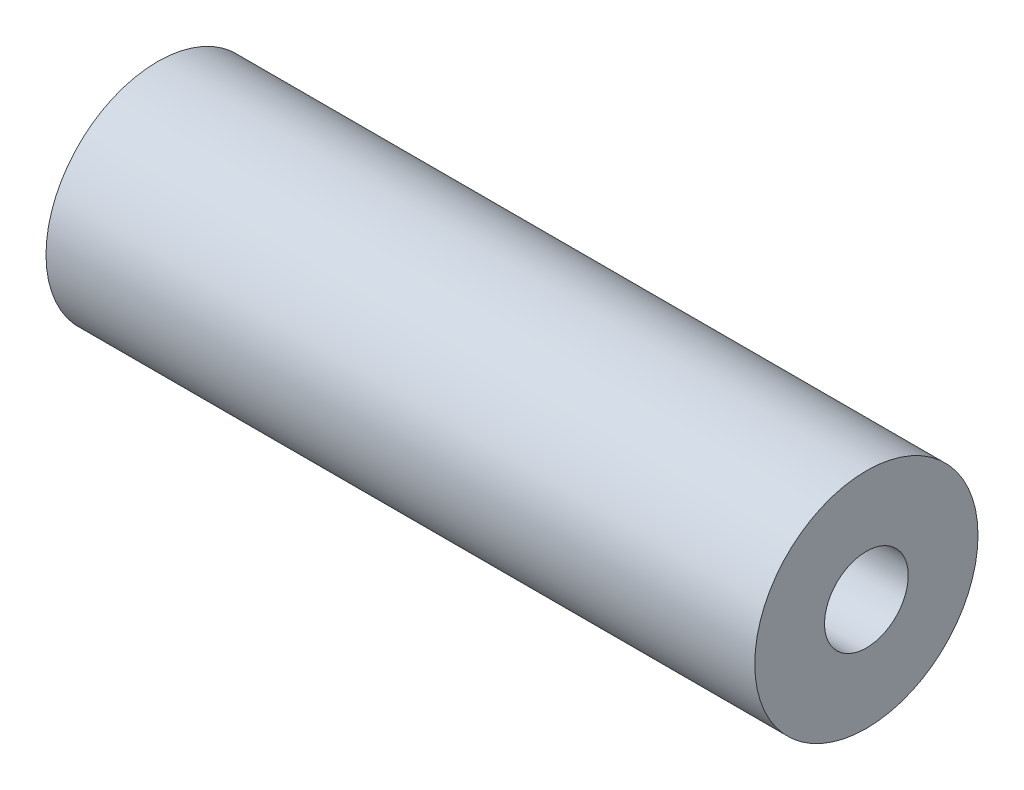
ISO-10303-21;
HEADER;
FILE_DESCRIPTION(('STEP AP214'),'2;1');
FILE_NAME('part.step','',(''),(''),'','','');
FILE_SCHEMA(('AUTOMOTIVE_DESIGN { 1 0 10303 214 1 1 1 1 }'));
ENDSEC;
DATA;
#1=APPLICATION_CONTEXT('core data for automotive mechanical design processes');
#2=APPLICATION_PROTOCOL_DEFINITION('international standard','automotive_design',2000,#1);
#3=PRODUCT_CONTEXT('',#1,'mechanical');
#4=PRODUCT('Part','Part','',(#3));
#5=PRODUCT_RELATED_PRODUCT_CATEGORY('part','',(#4));
#6=PRODUCT_DEFINITION_FORMATION('','',#4);
#7=PRODUCT_DEFINITION_CONTEXT('part definition',#1,'design');
#8=PRODUCT_DEFINITION('design','',#6,#7);
#9=PRODUCT_DEFINITION_SHAPE('','',#8);
#10=(LENGTH_UNIT() NAMED_UNIT(*) SI_UNIT(.MILLI.,.METRE.));
#11=(NAMED_UNIT(*) PLANE_ANGLE_UNIT() SI_UNIT($,.RADIAN.));
#12=(NAMED_UNIT(*) SI_UNIT($,.STERADIAN.) SOLID_ANGLE_UNIT());
#13=UNCERTAINTY_MEASURE_WITH_UNIT(LENGTH_MEASURE(1.E-05),#10,'distance_accuracy_value','');
#14=(GEOMETRIC_REPRESENTATION_CONTEXT(3) GLOBAL_UNCERTAINTY_ASSIGNED_CONTEXT((#13)) GLOBAL_UNIT_ASSIGNED_CONTEXT((#10,
#11,#12)) REPRESENTATION_CONTEXT('',''));
#15=CARTESIAN_POINT('',(0.,0.,0.));
#16=DIRECTION('',(0.,0.,1.));
#17=DIRECTION('',(1.,0.,0.));
#18=AXIS2_PLACEMENT_3D('',#15,#16,#17);
#19=CARTESIAN_POINT('',(25.4,0.,0.));
#20=DIRECTION('',(1.,0.,0.));
#21=DIRECTION('',(0.,0.,-1.));
#22=AXIS2_PLACEMENT_3D('',#19,#20,#21);
#23=PLANE('',#22);
#24=CARTESIAN_POINT('',(25.4,0.,0.));
#25=DIRECTION('',(1.,0.,0.));
#26=DIRECTION('',(0.,0.,-1.));
#27=AXIS2_PLACEMENT_3D('',#24,#25,#26);
#28=CIRCLE('',#27,4.);
#29=CARTESIAN_POINT('',(25.4,0.,-4.));
#30=VERTEX_POINT('',#29);
#31=EDGE_CURVE('E10',#30,#30,#28,.T.);
#32=ORIENTED_EDGE('',*,*,#31,.T.);
#33=EDGE_LOOP('',(#32));
#34=FACE_BOUND('',#33,.T.);
#35=CARTESIAN_POINT('',(25.4,0.,0.));
#36=DIRECTION('',(1.,0.,0.));
#37=DIRECTION('',(0.,0.,-1.));
#38=AXIS2_PLACEMENT_3D('',#35,#36,#37);
#39=CIRCLE('',#38,1.5);
#40=CARTESIAN_POINT('',(25.4,0.,-1.5));
#41=VERTEX_POINT('',#40);
#42=EDGE_CURVE('E42',#41,#41,#39,.T.);
#43=ORIENTED_EDGE('',*,*,#42,.F.);
#44=EDGE_LOOP('',(#43));
#45=FACE_BOUND('',#44,.T.);
#46=ADVANCED_FACE('F31',(#34,#45),#23,.T.);
#47=CARTESIAN_POINT('',(0.,0.,0.));
#48=DIRECTION('',(1.,0.,0.));
#49=DIRECTION('',(0.,0.,-1.));
#50=AXIS2_PLACEMENT_3D('',#47,#48,#49);
#51=PLANE('',#50);
#52=CARTESIAN_POINT('',(0.,0.,0.));
#53=DIRECTION('',(1.,0.,0.));
#54=DIRECTION('',(0.,0.,-1.));
#55=AXIS2_PLACEMENT_3D('',#52,#53,#54);
#56=CIRCLE('',#55,4.);
#57=CARTESIAN_POINT('',(0.,0.,-4.));
#58=VERTEX_POINT('',#57);
#59=EDGE_CURVE('E35',#58,#58,#56,.T.);
#60=ORIENTED_EDGE('',*,*,#59,.F.);
#61=EDGE_LOOP('',(#60));
#62=FACE_BOUND('',#61,.T.);
#63=CARTESIAN_POINT('',(0.,0.,0.));
#64=DIRECTION('',(1.,0.,0.));
#65=DIRECTION('',(0.,0.,-1.));
#66=AXIS2_PLACEMENT_3D('',#63,#64,#65);
#67=CIRCLE('',#66,1.5);
#68=CARTESIAN_POINT('',(0.,0.,-1.5));
#69=VERTEX_POINT('',#68);
#70=EDGE_CURVE('E44',#69,#69,#67,.T.);
#71=ORIENTED_EDGE('',*,*,#70,.T.);
#72=EDGE_LOOP('',(#71));
#73=FACE_BOUND('',#72,.T.);
#74=ADVANCED_FACE('F54',(#62,#73),#51,.F.);
#75=CARTESIAN_POINT('',(25.4,0.,0.));
#76=DIRECTION('',(-1.,0.,0.));
#77=DIRECTION('',(0.,0.,1.));
#78=AXIS2_PLACEMENT_3D('',#75,#76,#77);
#79=CYLINDRICAL_SURFACE('',#78,4.);
#80=ORIENTED_EDGE('',*,*,#31,.F.);
#81=EDGE_LOOP('',(#80));
#82=FACE_BOUND('',#81,.T.);
#83=ORIENTED_EDGE('',*,*,#59,.T.);
#84=EDGE_LOOP('',(#83));
#85=FACE_BOUND('',#84,.T.);
#86=ADVANCED_FACE('F33',(#82,#85),#79,.T.);
#87=CARTESIAN_POINT('',(25.4,0.,0.));
#88=DIRECTION('',(-1.,0.,0.));
#89=DIRECTION('',(0.,0.,1.));
#90=AXIS2_PLACEMENT_3D('',#87,#88,#89);
#91=CYLINDRICAL_SURFACE('',#90,1.5);
#92=ORIENTED_EDGE('',*,*,#42,.T.);
#93=EDGE_LOOP('',(#92));
#94=FACE_BOUND('',#93,.T.);
#95=ORIENTED_EDGE('',*,*,#70,.F.);
#96=EDGE_LOOP('',(#95));
#97=FACE_BOUND('',#96,.T.);
#98=ADVANCED_FACE('F50',(#94,#97),#91,.F.);
#99=CLOSED_SHELL('',(#46,#74,#86,#98));
#100=MANIFOLD_SOLID_BREP('B2',#99);
#101=ADVANCED_BREP_SHAPE_REPRESENTATION('',(#18,#100),#14);
#102=SHAPE_DEFINITION_REPRESENTATION(#9,#101);
ENDSEC;
END-ISO-10303-21;
